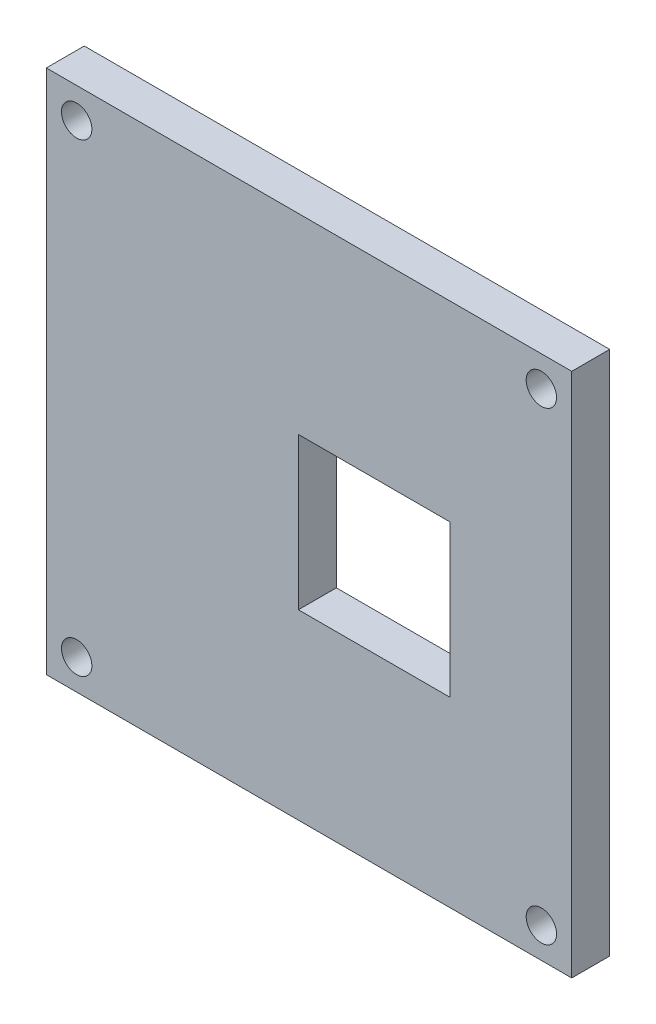
ISO-10303-21;
HEADER;
FILE_DESCRIPTION(('STEP AP214'),'2;1');
FILE_NAME('part.step','',(''),(''),'','','');
FILE_SCHEMA(('AUTOMOTIVE_DESIGN { 1 0 10303 214 1 1 1 1 }'));
ENDSEC;
DATA;
#1=APPLICATION_CONTEXT('core data for automotive mechanical design processes');
#2=APPLICATION_PROTOCOL_DEFINITION('international standard','automotive_design',2000,#1);
#3=PRODUCT_CONTEXT('',#1,'mechanical');
#4=PRODUCT('Part','Part','',(#3));
#5=PRODUCT_RELATED_PRODUCT_CATEGORY('part','',(#4));
#6=PRODUCT_DEFINITION_FORMATION('','',#4);
#7=PRODUCT_DEFINITION_CONTEXT('part definition',#1,'design');
#8=PRODUCT_DEFINITION('design','',#6,#7);
#9=PRODUCT_DEFINITION_SHAPE('','',#8);
#10=(LENGTH_UNIT() NAMED_UNIT(*) SI_UNIT(.MILLI.,.METRE.));
#11=(NAMED_UNIT(*) PLANE_ANGLE_UNIT() SI_UNIT($,.RADIAN.));
#12=(NAMED_UNIT(*) SI_UNIT($,.STERADIAN.) SOLID_ANGLE_UNIT());
#13=UNCERTAINTY_MEASURE_WITH_UNIT(LENGTH_MEASURE(1.E-05),#10,'distance_accuracy_value','');
#14=(GEOMETRIC_REPRESENTATION_CONTEXT(3) GLOBAL_UNCERTAINTY_ASSIGNED_CONTEXT((#13)) GLOBAL_UNIT_ASSIGNED_CONTEXT((#10,
#11,#12)) REPRESENTATION_CONTEXT('',''));
#15=CARTESIAN_POINT('',(0.,0.,0.));
#16=DIRECTION('',(0.,0.,1.));
#17=DIRECTION('',(1.,0.,0.));
#18=AXIS2_PLACEMENT_3D('',#15,#16,#17);
#19=CARTESIAN_POINT('',(0.,0.,3.175));
#20=DIRECTION('',(0.,0.,-1.));
#21=DIRECTION('',(-1.,0.,0.));
#22=AXIS2_PLACEMENT_3D('',#19,#20,#21);
#23=PLANE('',#22);
#24=CARTESIAN_POINT('',(2.54,2.54,3.175));
#25=DIRECTION('',(0.,0.,1.));
#26=DIRECTION('',(1.,0.,0.));
#27=AXIS2_PLACEMENT_3D('',#24,#25,#26);
#28=CIRCLE('',#27,1.27);
#29=CARTESIAN_POINT('',(3.81,2.54,3.175));
#30=VERTEX_POINT('',#29);
#31=EDGE_CURVE('E136',#30,#30,#28,.T.);
#32=ORIENTED_EDGE('',*,*,#31,.F.);
#33=EDGE_LOOP('',(#32));
#34=FACE_BOUND('',#33,.T.);
#35=CARTESIAN_POINT('',(41.402,2.54,3.175));
#36=DIRECTION('',(0.,0.,1.));
#37=DIRECTION('',(1.,0.,0.));
#38=AXIS2_PLACEMENT_3D('',#35,#36,#37);
#39=CIRCLE('',#38,1.27);
#40=CARTESIAN_POINT('',(42.672,2.54,3.175));
#41=VERTEX_POINT('',#40);
#42=EDGE_CURVE('E142',#41,#41,#39,.T.);
#43=ORIENTED_EDGE('',*,*,#42,.F.);
#44=EDGE_LOOP('',(#43));
#45=FACE_BOUND('',#44,.T.);
#46=CARTESIAN_POINT('',(41.402,41.402,3.175));
#47=DIRECTION('',(0.,0.,1.));
#48=DIRECTION('',(1.,0.,0.));
#49=AXIS2_PLACEMENT_3D('',#46,#47,#48);
#50=CIRCLE('',#49,1.27);
#51=CARTESIAN_POINT('',(42.672,41.402,3.175));
#52=VERTEX_POINT('',#51);
#53=EDGE_CURVE('E148',#52,#52,#50,.T.);
#54=ORIENTED_EDGE('',*,*,#53,.F.);
#55=EDGE_LOOP('',(#54));
#56=FACE_BOUND('',#55,.T.);
#57=CARTESIAN_POINT('',(2.54,41.402,3.175));
#58=DIRECTION('',(0.,0.,1.));
#59=DIRECTION('',(1.,0.,0.));
#60=AXIS2_PLACEMENT_3D('',#57,#58,#59);
#61=CIRCLE('',#60,1.27);
#62=CARTESIAN_POINT('',(3.81,41.402,3.175));
#63=VERTEX_POINT('',#62);
#64=EDGE_CURVE('E154',#63,#63,#61,.T.);
#65=ORIENTED_EDGE('',*,*,#64,.F.);
#66=EDGE_LOOP('',(#65));
#67=FACE_BOUND('',#66,.T.);
#68=DIRECTION('',(0.,-1.,0.));
#69=VECTOR('',#68,1.);
#70=CARTESIAN_POINT('',(0.,0.,3.175));
#71=LINE('',#70,#69);
#72=CARTESIAN_POINT('',(0.,43.942,3.175));
#73=VERTEX_POINT('',#72);
#74=CARTESIAN_POINT('',(0.,0.,3.175));
#75=VERTEX_POINT('',#74);
#76=EDGE_CURVE('E160',#73,#75,#71,.T.);
#77=ORIENTED_EDGE('',*,*,#76,.T.);
#78=DIRECTION('',(1.,0.,0.));
#79=VECTOR('',#78,1.);
#80=CARTESIAN_POINT('',(0.,0.,3.175));
#81=LINE('',#80,#79);
#82=CARTESIAN_POINT('',(43.942,0.,3.175));
#83=VERTEX_POINT('',#82);
#84=EDGE_CURVE('E163',#75,#83,#81,.T.);
#85=ORIENTED_EDGE('',*,*,#84,.T.);
#86=DIRECTION('',(0.,1.,0.));
#87=VECTOR('',#86,1.);
#88=CARTESIAN_POINT('',(43.942,0.,3.175));
#89=LINE('',#88,#87);
#90=CARTESIAN_POINT('',(43.942,43.942,3.175));
#91=VERTEX_POINT('',#90);
#92=EDGE_CURVE('E166',#83,#91,#89,.T.);
#93=ORIENTED_EDGE('',*,*,#92,.T.);
#94=DIRECTION('',(-1.,0.,0.));
#95=VECTOR('',#94,1.);
#96=CARTESIAN_POINT('',(0.,43.942,3.175));
#97=LINE('',#96,#95);
#98=EDGE_CURVE('E168',#91,#73,#97,.T.);
#99=ORIENTED_EDGE('',*,*,#98,.T.);
#100=EDGE_LOOP('',(#77,#85,#93,#99));
#101=FACE_BOUND('',#100,.T.);
#102=DIRECTION('',(0.,1.,0.));
#103=VECTOR('',#102,1.);
#104=CARTESIAN_POINT('',(33.782,15.24,3.175));
#105=LINE('',#104,#103);
#106=CARTESIAN_POINT('',(33.782,15.24,3.175));
#107=VERTEX_POINT('',#106);
#108=CARTESIAN_POINT('',(33.782,27.94,3.175));
#109=VERTEX_POINT('',#108);
#110=EDGE_CURVE('E100',#107,#109,#105,.T.);
#111=ORIENTED_EDGE('',*,*,#110,.F.);
#112=DIRECTION('',(1.,0.,0.));
#113=VECTOR('',#112,1.);
#114=CARTESIAN_POINT('',(21.082,15.24,3.175));
#115=LINE('',#114,#113);
#116=CARTESIAN_POINT('',(21.082,15.24,3.175));
#117=VERTEX_POINT('',#116);
#118=EDGE_CURVE('E122',#117,#107,#115,.T.);
#119=ORIENTED_EDGE('',*,*,#118,.F.);
#120=DIRECTION('',(0.,-1.,0.));
#121=VECTOR('',#120,1.);
#122=CARTESIAN_POINT('',(21.082,15.24,3.175));
#123=LINE('',#122,#121);
#124=CARTESIAN_POINT('',(21.082,27.94,3.175));
#125=VERTEX_POINT('',#124);
#126=EDGE_CURVE('E120',#125,#117,#123,.T.);
#127=ORIENTED_EDGE('',*,*,#126,.F.);
#128=DIRECTION('',(-1.,0.,0.));
#129=VECTOR('',#128,1.);
#130=CARTESIAN_POINT('',(21.082,27.94,3.175));
#131=LINE('',#130,#129);
#132=EDGE_CURVE('E108',#109,#125,#131,.T.);
#133=ORIENTED_EDGE('',*,*,#132,.F.);
#134=EDGE_LOOP('',(#111,#119,#127,#133));
#135=FACE_BOUND('',#134,.T.);
#136=ADVANCED_FACE('F35',(#34,#45,#56,#67,#101,#135),#23,.F.);
#137=CARTESIAN_POINT('',(0.,0.,0.));
#138=DIRECTION('',(0.,0.,-1.));
#139=DIRECTION('',(-1.,0.,0.));
#140=AXIS2_PLACEMENT_3D('',#137,#138,#139);
#141=PLANE('',#140);
#142=CARTESIAN_POINT('',(41.402,2.54,0.));
#143=DIRECTION('',(0.,0.,1.));
#144=DIRECTION('',(1.,0.,0.));
#145=AXIS2_PLACEMENT_3D('',#142,#143,#144);
#146=CIRCLE('',#145,1.27);
#147=CARTESIAN_POINT('',(42.672,2.54,0.));
#148=VERTEX_POINT('',#147);
#149=EDGE_CURVE('E139',#148,#148,#146,.T.);
#150=ORIENTED_EDGE('',*,*,#149,.T.);
#151=EDGE_LOOP('',(#150));
#152=FACE_BOUND('',#151,.T.);
#153=CARTESIAN_POINT('',(2.54,41.402,0.));
#154=DIRECTION('',(0.,0.,1.));
#155=DIRECTION('',(1.,0.,0.));
#156=AXIS2_PLACEMENT_3D('',#153,#154,#155);
#157=CIRCLE('',#156,1.27);
#158=CARTESIAN_POINT('',(3.81,41.402,0.));
#159=VERTEX_POINT('',#158);
#160=EDGE_CURVE('E151',#159,#159,#157,.T.);
#161=ORIENTED_EDGE('',*,*,#160,.T.);
#162=EDGE_LOOP('',(#161));
#163=FACE_BOUND('',#162,.T.);
#164=DIRECTION('',(0.,-1.,0.));
#165=VECTOR('',#164,1.);
#166=CARTESIAN_POINT('',(0.,0.,0.));
#167=LINE('',#166,#165);
#168=CARTESIAN_POINT('',(0.,43.942,0.));
#169=VERTEX_POINT('',#168);
#170=CARTESIAN_POINT('',(0.,0.,0.));
#171=VERTEX_POINT('',#170);
#172=EDGE_CURVE('E157',#169,#171,#167,.T.);
#173=ORIENTED_EDGE('',*,*,#172,.F.);
#174=DIRECTION('',(-1.,0.,0.));
#175=VECTOR('',#174,1.);
#176=CARTESIAN_POINT('',(0.,43.942,0.));
#177=LINE('',#176,#175);
#178=CARTESIAN_POINT('',(43.942,43.942,0.));
#179=VERTEX_POINT('',#178);
#180=EDGE_CURVE('E164',#179,#169,#177,.T.);
#181=ORIENTED_EDGE('',*,*,#180,.F.);
#182=DIRECTION('',(0.,1.,0.));
#183=VECTOR('',#182,1.);
#184=CARTESIAN_POINT('',(43.942,0.,0.));
#185=LINE('',#184,#183);
#186=CARTESIAN_POINT('',(43.942,0.,0.));
#187=VERTEX_POINT('',#186);
#188=EDGE_CURVE('E175',#187,#179,#185,.T.);
#189=ORIENTED_EDGE('',*,*,#188,.F.);
#190=DIRECTION('',(1.,0.,0.));
#191=VECTOR('',#190,1.);
#192=CARTESIAN_POINT('',(0.,0.,0.));
#193=LINE('',#192,#191);
#194=EDGE_CURVE('E173',#171,#187,#193,.T.);
#195=ORIENTED_EDGE('',*,*,#194,.F.);
#196=EDGE_LOOP('',(#173,#181,#189,#195));
#197=FACE_BOUND('',#196,.T.);
#198=CARTESIAN_POINT('',(41.402,41.402,0.));
#199=DIRECTION('',(0.,0.,1.));
#200=DIRECTION('',(1.,0.,0.));
#201=AXIS2_PLACEMENT_3D('',#198,#199,#200);
#202=CIRCLE('',#201,1.27);
#203=CARTESIAN_POINT('',(42.672,41.402,0.));
#204=VERTEX_POINT('',#203);
#205=EDGE_CURVE('E145',#204,#204,#202,.T.);
#206=ORIENTED_EDGE('',*,*,#205,.T.);
#207=EDGE_LOOP('',(#206));
#208=FACE_BOUND('',#207,.T.);
#209=CARTESIAN_POINT('',(2.54,2.54,0.));
#210=DIRECTION('',(0.,0.,1.));
#211=DIRECTION('',(1.,0.,0.));
#212=AXIS2_PLACEMENT_3D('',#209,#210,#211);
#213=CIRCLE('',#212,1.27);
#214=CARTESIAN_POINT('',(3.81,2.54,0.));
#215=VERTEX_POINT('',#214);
#216=EDGE_CURVE('E116',#215,#215,#213,.T.);
#217=ORIENTED_EDGE('',*,*,#216,.T.);
#218=EDGE_LOOP('',(#217));
#219=FACE_BOUND('',#218,.T.);
#220=DIRECTION('',(1.,0.,0.));
#221=VECTOR('',#220,1.);
#222=CARTESIAN_POINT('',(21.082,15.24,0.));
#223=LINE('',#222,#221);
#224=CARTESIAN_POINT('',(21.082,15.24,0.));
#225=VERTEX_POINT('',#224);
#226=CARTESIAN_POINT('',(33.782,15.24,0.));
#227=VERTEX_POINT('',#226);
#228=EDGE_CURVE('E109',#225,#227,#223,.T.);
#229=ORIENTED_EDGE('',*,*,#228,.T.);
#230=DIRECTION('',(0.,1.,0.));
#231=VECTOR('',#230,1.);
#232=CARTESIAN_POINT('',(33.782,15.24,0.));
#233=LINE('',#232,#231);
#234=CARTESIAN_POINT('',(33.782,27.94,0.));
#235=VERTEX_POINT('',#234);
#236=EDGE_CURVE('E58',#227,#235,#233,.T.);
#237=ORIENTED_EDGE('',*,*,#236,.T.);
#238=DIRECTION('',(-1.,0.,0.));
#239=VECTOR('',#238,1.);
#240=CARTESIAN_POINT('',(21.082,27.94,0.));
#241=LINE('',#240,#239);
#242=CARTESIAN_POINT('',(21.082,27.94,0.));
#243=VERTEX_POINT('',#242);
#244=EDGE_CURVE('E115',#235,#243,#241,.T.);
#245=ORIENTED_EDGE('',*,*,#244,.T.);
#246=DIRECTION('',(0.,-1.,0.));
#247=VECTOR('',#246,1.);
#248=CARTESIAN_POINT('',(21.082,15.24,0.));
#249=LINE('',#248,#247);
#250=EDGE_CURVE('E128',#243,#225,#249,.T.);
#251=ORIENTED_EDGE('',*,*,#250,.T.);
#252=EDGE_LOOP('',(#229,#237,#245,#251));
#253=FACE_BOUND('',#252,.T.);
#254=ADVANCED_FACE('F193',(#152,#163,#197,#208,#219,#253),#141,.T.);
#255=CARTESIAN_POINT('',(0.,0.,3.175));
#256=DIRECTION('',(1.,0.,0.));
#257=DIRECTION('',(0.,0.,-1.));
#258=AXIS2_PLACEMENT_3D('',#255,#256,#257);
#259=PLANE('',#258);
#260=ORIENTED_EDGE('',*,*,#172,.T.);
#261=DIRECTION('',(0.,0.,-1.));
#262=VECTOR('',#261,1.);
#263=CARTESIAN_POINT('',(0.,0.,3.175));
#264=LINE('',#263,#262);
#265=EDGE_CURVE('E11',#75,#171,#264,.T.);
#266=ORIENTED_EDGE('',*,*,#265,.F.);
#267=ORIENTED_EDGE('',*,*,#76,.F.);
#268=DIRECTION('',(0.,0.,-1.));
#269=VECTOR('',#268,1.);
#270=CARTESIAN_POINT('',(0.,43.942,3.175));
#271=LINE('',#270,#269);
#272=EDGE_CURVE('E170',#73,#169,#271,.T.);
#273=ORIENTED_EDGE('',*,*,#272,.T.);
#274=EDGE_LOOP('',(#260,#266,#267,#273));
#275=FACE_BOUND('',#274,.T.);
#276=ADVANCED_FACE('F37',(#275),#259,.F.);
#277=CARTESIAN_POINT('',(0.,0.,3.175));
#278=DIRECTION('',(0.,1.,0.));
#279=DIRECTION('',(0.,0.,1.));
#280=AXIS2_PLACEMENT_3D('',#277,#278,#279);
#281=PLANE('',#280);
#282=ORIENTED_EDGE('',*,*,#194,.T.);
#283=DIRECTION('',(0.,0.,-1.));
#284=VECTOR('',#283,1.);
#285=CARTESIAN_POINT('',(43.942,0.,3.175));
#286=LINE('',#285,#284);
#287=EDGE_CURVE('E43',#83,#187,#286,.T.);
#288=ORIENTED_EDGE('',*,*,#287,.F.);
#289=ORIENTED_EDGE('',*,*,#84,.F.);
#290=ORIENTED_EDGE('',*,*,#265,.T.);
#291=EDGE_LOOP('',(#282,#288,#289,#290));
#292=FACE_BOUND('',#291,.T.);
#293=ADVANCED_FACE('F203',(#292),#281,.F.);
#294=CARTESIAN_POINT('',(43.942,0.,3.175));
#295=DIRECTION('',(-1.,0.,0.));
#296=DIRECTION('',(0.,0.,1.));
#297=AXIS2_PLACEMENT_3D('',#294,#295,#296);
#298=PLANE('',#297);
#299=ORIENTED_EDGE('',*,*,#188,.T.);
#300=DIRECTION('',(0.,0.,-1.));
#301=VECTOR('',#300,1.);
#302=CARTESIAN_POINT('',(43.942,43.942,3.175));
#303=LINE('',#302,#301);
#304=EDGE_CURVE('E180',#91,#179,#303,.T.);
#305=ORIENTED_EDGE('',*,*,#304,.F.);
#306=ORIENTED_EDGE('',*,*,#92,.F.);
#307=ORIENTED_EDGE('',*,*,#287,.T.);
#308=EDGE_LOOP('',(#299,#305,#306,#307));
#309=FACE_BOUND('',#308,.T.);
#310=ADVANCED_FACE('F187',(#309),#298,.F.);
#311=CARTESIAN_POINT('',(0.,43.942,3.175));
#312=DIRECTION('',(0.,-1.,0.));
#313=DIRECTION('',(0.,0.,-1.));
#314=AXIS2_PLACEMENT_3D('',#311,#312,#313);
#315=PLANE('',#314);
#316=ORIENTED_EDGE('',*,*,#180,.T.);
#317=ORIENTED_EDGE('',*,*,#272,.F.);
#318=ORIENTED_EDGE('',*,*,#98,.F.);
#319=ORIENTED_EDGE('',*,*,#304,.T.);
#320=EDGE_LOOP('',(#316,#317,#318,#319));
#321=FACE_BOUND('',#320,.T.);
#322=ADVANCED_FACE('F197',(#321),#315,.F.);
#323=CARTESIAN_POINT('',(2.54,41.402,3.175));
#324=DIRECTION('',(0.,0.,-1.));
#325=DIRECTION('',(-1.,0.,0.));
#326=AXIS2_PLACEMENT_3D('',#323,#324,#325);
#327=CYLINDRICAL_SURFACE('',#326,1.27);
#328=ORIENTED_EDGE('',*,*,#64,.T.);
#329=EDGE_LOOP('',(#328));
#330=FACE_BOUND('',#329,.T.);
#331=ORIENTED_EDGE('',*,*,#160,.F.);
#332=EDGE_LOOP('',(#331));
#333=FACE_BOUND('',#332,.T.);
#334=ADVANCED_FACE('F221',(#330,#333),#327,.F.);
#335=CARTESIAN_POINT('',(41.402,41.402,3.175));
#336=DIRECTION('',(0.,0.,-1.));
#337=DIRECTION('',(-1.,0.,0.));
#338=AXIS2_PLACEMENT_3D('',#335,#336,#337);
#339=CYLINDRICAL_SURFACE('',#338,1.27);
#340=ORIENTED_EDGE('',*,*,#53,.T.);
#341=EDGE_LOOP('',(#340));
#342=FACE_BOUND('',#341,.T.);
#343=ORIENTED_EDGE('',*,*,#205,.F.);
#344=EDGE_LOOP('',(#343));
#345=FACE_BOUND('',#344,.T.);
#346=ADVANCED_FACE('F228',(#342,#345),#339,.F.);
#347=CARTESIAN_POINT('',(41.402,2.54,3.175));
#348=DIRECTION('',(0.,0.,-1.));
#349=DIRECTION('',(-1.,0.,0.));
#350=AXIS2_PLACEMENT_3D('',#347,#348,#349);
#351=CYLINDRICAL_SURFACE('',#350,1.27);
#352=ORIENTED_EDGE('',*,*,#42,.T.);
#353=EDGE_LOOP('',(#352));
#354=FACE_BOUND('',#353,.T.);
#355=ORIENTED_EDGE('',*,*,#149,.F.);
#356=EDGE_LOOP('',(#355));
#357=FACE_BOUND('',#356,.T.);
#358=ADVANCED_FACE('F233',(#354,#357),#351,.F.);
#359=CARTESIAN_POINT('',(2.54,2.54,3.175));
#360=DIRECTION('',(0.,0.,-1.));
#361=DIRECTION('',(-1.,0.,0.));
#362=AXIS2_PLACEMENT_3D('',#359,#360,#361);
#363=CYLINDRICAL_SURFACE('',#362,1.27);
#364=ORIENTED_EDGE('',*,*,#31,.T.);
#365=EDGE_LOOP('',(#364));
#366=FACE_BOUND('',#365,.T.);
#367=ORIENTED_EDGE('',*,*,#216,.F.);
#368=EDGE_LOOP('',(#367));
#369=FACE_BOUND('',#368,.T.);
#370=ADVANCED_FACE('F243',(#366,#369),#363,.F.);
#371=CARTESIAN_POINT('',(33.782,15.24,3.175));
#372=DIRECTION('',(-1.,0.,0.));
#373=DIRECTION('',(0.,0.,1.));
#374=AXIS2_PLACEMENT_3D('',#371,#372,#373);
#375=PLANE('',#374);
#376=ORIENTED_EDGE('',*,*,#236,.F.);
#377=DIRECTION('',(0.,0.,-1.));
#378=VECTOR('',#377,1.);
#379=CARTESIAN_POINT('',(33.782,15.24,3.175));
#380=LINE('',#379,#378);
#381=EDGE_CURVE('E104',#107,#227,#380,.T.);
#382=ORIENTED_EDGE('',*,*,#381,.F.);
#383=ORIENTED_EDGE('',*,*,#110,.T.);
#384=DIRECTION('',(0.,0.,-1.));
#385=VECTOR('',#384,1.);
#386=CARTESIAN_POINT('',(33.782,27.94,3.175));
#387=LINE('',#386,#385);
#388=EDGE_CURVE('E103',#109,#235,#387,.T.);
#389=ORIENTED_EDGE('',*,*,#388,.T.);
#390=EDGE_LOOP('',(#376,#382,#383,#389));
#391=FACE_BOUND('',#390,.T.);
#392=ADVANCED_FACE('F102',(#391),#375,.T.);
#393=CARTESIAN_POINT('',(21.082,27.94,3.175));
#394=DIRECTION('',(0.,-1.,0.));
#395=DIRECTION('',(0.,0.,-1.));
#396=AXIS2_PLACEMENT_3D('',#393,#394,#395);
#397=PLANE('',#396);
#398=ORIENTED_EDGE('',*,*,#244,.F.);
#399=ORIENTED_EDGE('',*,*,#388,.F.);
#400=ORIENTED_EDGE('',*,*,#132,.T.);
#401=DIRECTION('',(0.,0.,-1.));
#402=VECTOR('',#401,1.);
#403=CARTESIAN_POINT('',(21.082,27.94,3.175));
#404=LINE('',#403,#402);
#405=EDGE_CURVE('E117',#125,#243,#404,.T.);
#406=ORIENTED_EDGE('',*,*,#405,.T.);
#407=EDGE_LOOP('',(#398,#399,#400,#406));
#408=FACE_BOUND('',#407,.T.);
#409=ADVANCED_FACE('F112',(#408),#397,.T.);
#410=CARTESIAN_POINT('',(21.082,15.24,3.175));
#411=DIRECTION('',(1.,0.,0.));
#412=DIRECTION('',(0.,0.,-1.));
#413=AXIS2_PLACEMENT_3D('',#410,#411,#412);
#414=PLANE('',#413);
#415=ORIENTED_EDGE('',*,*,#250,.F.);
#416=ORIENTED_EDGE('',*,*,#405,.F.);
#417=ORIENTED_EDGE('',*,*,#126,.T.);
#418=DIRECTION('',(0.,0.,-1.));
#419=VECTOR('',#418,1.);
#420=CARTESIAN_POINT('',(21.082,15.24,3.175));
#421=LINE('',#420,#419);
#422=EDGE_CURVE('E50',#117,#225,#421,.T.);
#423=ORIENTED_EDGE('',*,*,#422,.T.);
#424=EDGE_LOOP('',(#415,#416,#417,#423));
#425=FACE_BOUND('',#424,.T.);
#426=ADVANCED_FACE('F255',(#425),#414,.T.);
#427=CARTESIAN_POINT('',(21.082,15.24,3.175));
#428=DIRECTION('',(0.,1.,0.));
#429=DIRECTION('',(0.,0.,1.));
#430=AXIS2_PLACEMENT_3D('',#427,#428,#429);
#431=PLANE('',#430);
#432=ORIENTED_EDGE('',*,*,#228,.F.);
#433=ORIENTED_EDGE('',*,*,#422,.F.);
#434=ORIENTED_EDGE('',*,*,#118,.T.);
#435=ORIENTED_EDGE('',*,*,#381,.T.);
#436=EDGE_LOOP('',(#432,#433,#434,#435));
#437=FACE_BOUND('',#436,.T.);
#438=ADVANCED_FACE('F258',(#437),#431,.T.);
#439=CLOSED_SHELL('',(#136,#254,#276,#293,#310,#322,#334,#346,#358,#370,#392,#409,#426,#438));
#440=MANIFOLD_SOLID_BREP('B2',#439);
#441=ADVANCED_BREP_SHAPE_REPRESENTATION('',(#18,#440),#14);
#442=SHAPE_DEFINITION_REPRESENTATION(#9,#441);
ENDSEC;
END-ISO-10303-21;
